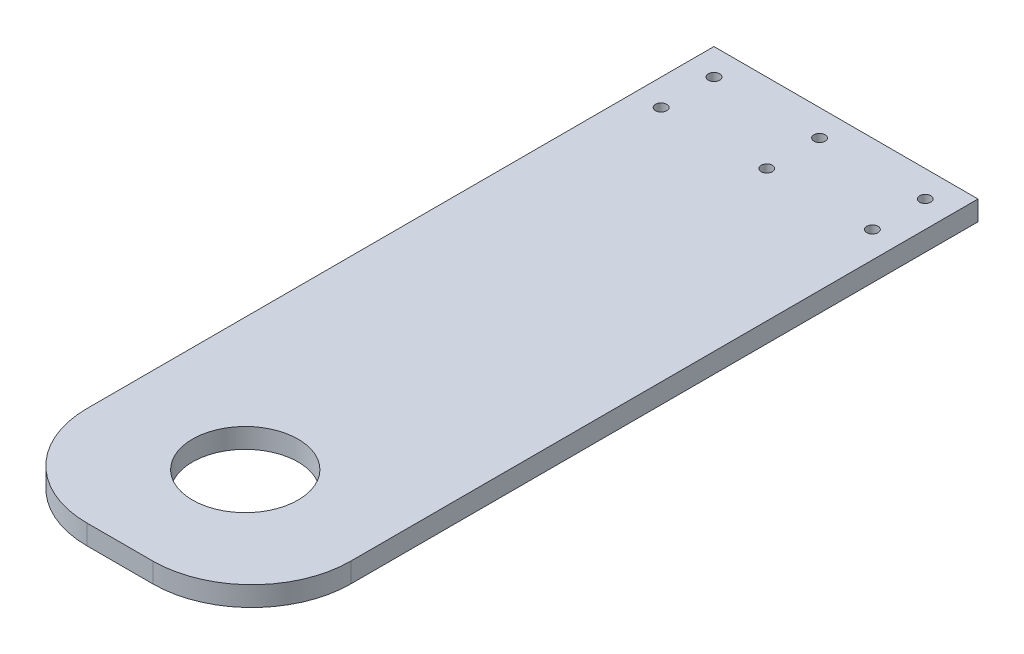
ISO-10303-21;
HEADER;
FILE_DESCRIPTION(('STEP AP214'),'2;1');
FILE_NAME('part.step','',(''),(''),'','','');
FILE_SCHEMA(('AUTOMOTIVE_DESIGN { 1 0 10303 214 1 1 1 1 }'));
ENDSEC;
DATA;
#1=APPLICATION_CONTEXT('core data for automotive mechanical design processes');
#2=APPLICATION_PROTOCOL_DEFINITION('international standard','automotive_design',2000,#1);
#3=PRODUCT_CONTEXT('',#1,'mechanical');
#4=PRODUCT('Part','Part','',(#3));
#5=PRODUCT_RELATED_PRODUCT_CATEGORY('part','',(#4));
#6=PRODUCT_DEFINITION_FORMATION('','',#4);
#7=PRODUCT_DEFINITION_CONTEXT('part definition',#1,'design');
#8=PRODUCT_DEFINITION('design','',#6,#7);
#9=PRODUCT_DEFINITION_SHAPE('','',#8);
#10=(LENGTH_UNIT() NAMED_UNIT(*) SI_UNIT(.MILLI.,.METRE.));
#11=(NAMED_UNIT(*) PLANE_ANGLE_UNIT() SI_UNIT($,.RADIAN.));
#12=(NAMED_UNIT(*) SI_UNIT($,.STERADIAN.) SOLID_ANGLE_UNIT());
#13=UNCERTAINTY_MEASURE_WITH_UNIT(LENGTH_MEASURE(1.E-05),#10,'distance_accuracy_value','');
#14=(GEOMETRIC_REPRESENTATION_CONTEXT(3) GLOBAL_UNCERTAINTY_ASSIGNED_CONTEXT((#13)) GLOBAL_UNIT_ASSIGNED_CONTEXT((#10,
#11,#12)) REPRESENTATION_CONTEXT('',''));
#15=CARTESIAN_POINT('',(0.,0.,0.));
#16=DIRECTION('',(0.,0.,1.));
#17=DIRECTION('',(1.,0.,0.));
#18=AXIS2_PLACEMENT_3D('',#15,#16,#17);
#19=CARTESIAN_POINT('',(0.,6.,0.));
#20=DIRECTION('',(1.,0.,0.));
#21=DIRECTION('',(0.,0.,-1.));
#22=AXIS2_PLACEMENT_3D('',#19,#20,#21);
#23=PLANE('',#22);
#24=DIRECTION('',(0.,0.,1.));
#25=VECTOR('',#24,1.);
#26=CARTESIAN_POINT('',(0.,6.,0.));
#27=LINE('',#26,#25);
#28=CARTESIAN_POINT('',(0.,6.,10.));
#29=VERTEX_POINT('',#28);
#30=CARTESIAN_POINT('',(0.,6.,200.));
#31=VERTEX_POINT('',#30);
#32=EDGE_CURVE('E115',#29,#31,#27,.T.);
#33=ORIENTED_EDGE('',*,*,#32,.F.);
#34=DIRECTION('',(0.,1.,0.));
#35=VECTOR('',#34,1.);
#36=CARTESIAN_POINT('',(0.,0.,10.));
#37=LINE('',#36,#35);
#38=CARTESIAN_POINT('',(0.,0.,10.));
#39=VERTEX_POINT('',#38);
#40=EDGE_CURVE('E101',#39,#29,#37,.T.);
#41=ORIENTED_EDGE('',*,*,#40,.F.);
#42=DIRECTION('',(0.,0.,1.));
#43=VECTOR('',#42,1.);
#44=CARTESIAN_POINT('',(0.,0.,0.));
#45=LINE('',#44,#43);
#46=CARTESIAN_POINT('',(0.,0.,200.));
#47=VERTEX_POINT('',#46);
#48=EDGE_CURVE('E113',#39,#47,#45,.T.);
#49=ORIENTED_EDGE('',*,*,#48,.T.);
#50=DIRECTION('',(0.,-1.,0.));
#51=VECTOR('',#50,1.);
#52=CARTESIAN_POINT('',(0.,6.,200.));
#53=LINE('',#52,#51);
#54=EDGE_CURVE('E152',#47,#31,#53,.F.);
#55=ORIENTED_EDGE('',*,*,#54,.T.);
#56=EDGE_LOOP('',(#33,#41,#49,#55));
#57=FACE_BOUND('',#56,.T.);
#58=ADVANCED_FACE('F45',(#57),#23,.F.);
#59=CARTESIAN_POINT('',(0.,6.,230.));
#60=DIRECTION('',(0.,0.,-1.));
#61=DIRECTION('',(-1.,0.,0.));
#62=AXIS2_PLACEMENT_3D('',#59,#60,#61);
#63=PLANE('',#62);
#64=DIRECTION('',(1.,0.,0.));
#65=VECTOR('',#64,1.);
#66=CARTESIAN_POINT('',(0.,6.,230.));
#67=LINE('',#66,#65);
#68=CARTESIAN_POINT('',(30.,6.,230.));
#69=VERTEX_POINT('',#68);
#70=CARTESIAN_POINT('',(50.,6.,230.));
#71=VERTEX_POINT('',#70);
#72=EDGE_CURVE('E161',#69,#71,#67,.T.);
#73=ORIENTED_EDGE('',*,*,#72,.F.);
#74=DIRECTION('',(0.,-1.,0.));
#75=VECTOR('',#74,1.);
#76=CARTESIAN_POINT('',(30.,6.,230.));
#77=LINE('',#76,#75);
#78=CARTESIAN_POINT('',(30.,0.,230.));
#79=VERTEX_POINT('',#78);
#80=EDGE_CURVE('E143',#69,#79,#77,.T.);
#81=ORIENTED_EDGE('',*,*,#80,.T.);
#82=DIRECTION('',(1.,0.,0.));
#83=VECTOR('',#82,1.);
#84=CARTESIAN_POINT('',(0.,0.,230.));
#85=LINE('',#84,#83);
#86=CARTESIAN_POINT('',(50.,0.,230.));
#87=VERTEX_POINT('',#86);
#88=EDGE_CURVE('E123',#79,#87,#85,.T.);
#89=ORIENTED_EDGE('',*,*,#88,.T.);
#90=DIRECTION('',(0.,-1.,0.));
#91=VECTOR('',#90,1.);
#92=CARTESIAN_POINT('',(50.,6.,230.));
#93=LINE('',#92,#91);
#94=EDGE_CURVE('E140',#87,#71,#93,.F.);
#95=ORIENTED_EDGE('',*,*,#94,.T.);
#96=EDGE_LOOP('',(#73,#81,#89,#95));
#97=FACE_BOUND('',#96,.T.);
#98=ADVANCED_FACE('F165',(#97),#63,.F.);
#99=CARTESIAN_POINT('',(80.,6.,0.));
#100=DIRECTION('',(-1.,0.,0.));
#101=DIRECTION('',(0.,0.,1.));
#102=AXIS2_PLACEMENT_3D('',#99,#100,#101);
#103=PLANE('',#102);
#104=DIRECTION('',(0.,0.,-1.));
#105=VECTOR('',#104,1.);
#106=CARTESIAN_POINT('',(80.,0.,0.));
#107=LINE('',#106,#105);
#108=CARTESIAN_POINT('',(80.,0.,200.));
#109=VERTEX_POINT('',#108);
#110=CARTESIAN_POINT('',(80.,0.,10.));
#111=VERTEX_POINT('',#110);
#112=EDGE_CURVE('E129',#109,#111,#107,.T.);
#113=ORIENTED_EDGE('',*,*,#112,.T.);
#114=DIRECTION('',(0.,1.,0.));
#115=VECTOR('',#114,1.);
#116=CARTESIAN_POINT('',(80.,0.,10.));
#117=LINE('',#116,#115);
#118=CARTESIAN_POINT('',(80.,6.,10.));
#119=VERTEX_POINT('',#118);
#120=EDGE_CURVE('E61',#111,#119,#117,.T.);
#121=ORIENTED_EDGE('',*,*,#120,.T.);
#122=DIRECTION('',(0.,0.,-1.));
#123=VECTOR('',#122,1.);
#124=CARTESIAN_POINT('',(80.,6.,0.));
#125=LINE('',#124,#123);
#126=CARTESIAN_POINT('',(80.,6.,200.));
#127=VERTEX_POINT('',#126);
#128=EDGE_CURVE('E135',#127,#119,#125,.T.);
#129=ORIENTED_EDGE('',*,*,#128,.F.);
#130=DIRECTION('',(0.,-1.,0.));
#131=VECTOR('',#130,1.);
#132=CARTESIAN_POINT('',(80.,6.,200.));
#133=LINE('',#132,#131);
#134=EDGE_CURVE('E11',#127,#109,#133,.T.);
#135=ORIENTED_EDGE('',*,*,#134,.T.);
#136=EDGE_LOOP('',(#113,#121,#129,#135));
#137=FACE_BOUND('',#136,.T.);
#138=ADVANCED_FACE('F186',(#137),#103,.F.);
#139=CARTESIAN_POINT('',(0.,6.,0.));
#140=DIRECTION('',(0.,1.,0.));
#141=DIRECTION('',(0.,0.,1.));
#142=AXIS2_PLACEMENT_3D('',#139,#140,#141);
#143=PLANE('',#142);
#144=DIRECTION('',(1.,0.,0.));
#145=VECTOR('',#144,1.);
#146=CARTESIAN_POINT('',(0.,6.,10.));
#147=LINE('',#146,#145);
#148=EDGE_CURVE('E108',#29,#119,#147,.T.);
#149=ORIENTED_EDGE('',*,*,#148,.F.);
#150=ORIENTED_EDGE('',*,*,#32,.T.);
#151=CARTESIAN_POINT('',(30.,6.,200.));
#152=DIRECTION('',(0.,1.,0.));
#153=DIRECTION('',(0.,0.,1.));
#154=AXIS2_PLACEMENT_3D('',#151,#152,#153);
#155=CIRCLE('',#154,30.);
#156=EDGE_CURVE('E54',#31,#69,#155,.T.);
#157=ORIENTED_EDGE('',*,*,#156,.T.);
#158=ORIENTED_EDGE('',*,*,#72,.T.);
#159=CARTESIAN_POINT('',(50.,6.,200.));
#160=DIRECTION('',(0.,1.,0.));
#161=DIRECTION('',(0.,0.,1.));
#162=AXIS2_PLACEMENT_3D('',#159,#160,#161);
#163=CIRCLE('',#162,30.);
#164=EDGE_CURVE('E69',#71,#127,#163,.T.);
#165=ORIENTED_EDGE('',*,*,#164,.T.);
#166=ORIENTED_EDGE('',*,*,#128,.T.);
#167=EDGE_LOOP('',(#149,#150,#157,#158,#165,#166));
#168=FACE_BOUND('',#167,.T.);
#169=CARTESIAN_POINT('',(8.,6.,18.));
#170=DIRECTION('',(0.,-1.,0.));
#171=DIRECTION('',(0.,0.,-1.));
#172=AXIS2_PLACEMENT_3D('',#169,#170,#171);
#173=CIRCLE('',#172,1.7);
#174=CARTESIAN_POINT('',(8.,6.,16.3));
#175=VERTEX_POINT('',#174);
#176=EDGE_CURVE('E443',#175,#175,#173,.T.);
#177=ORIENTED_EDGE('',*,*,#176,.T.);
#178=EDGE_LOOP('',(#177));
#179=FACE_BOUND('',#178,.T.);
#180=CARTESIAN_POINT('',(40.,6.,18.));
#181=DIRECTION('',(0.,-1.,0.));
#182=DIRECTION('',(0.,0.,-1.));
#183=AXIS2_PLACEMENT_3D('',#180,#181,#182);
#184=CIRCLE('',#183,1.7);
#185=CARTESIAN_POINT('',(40.,6.,16.3));
#186=VERTEX_POINT('',#185);
#187=EDGE_CURVE('E459',#186,#186,#184,.T.);
#188=ORIENTED_EDGE('',*,*,#187,.T.);
#189=EDGE_LOOP('',(#188));
#190=FACE_BOUND('',#189,.T.);
#191=CARTESIAN_POINT('',(72.,6.,18.));
#192=DIRECTION('',(0.,-1.,0.));
#193=DIRECTION('',(0.,0.,-1.));
#194=AXIS2_PLACEMENT_3D('',#191,#192,#193);
#195=CIRCLE('',#194,1.69999999999999);
#196=CARTESIAN_POINT('',(72.,6.,16.3));
#197=VERTEX_POINT('',#196);
#198=EDGE_CURVE('E475',#197,#197,#195,.T.);
#199=ORIENTED_EDGE('',*,*,#198,.T.);
#200=EDGE_LOOP('',(#199));
#201=FACE_BOUND('',#200,.T.);
#202=CARTESIAN_POINT('',(40.0000000000002,6.,34.));
#203=DIRECTION('',(0.,-1.,0.));
#204=DIRECTION('',(0.,0.,-1.));
#205=AXIS2_PLACEMENT_3D('',#202,#203,#204);
#206=CIRCLE('',#205,1.7);
#207=CARTESIAN_POINT('',(40.0000000000002,6.,32.3));
#208=VERTEX_POINT('',#207);
#209=EDGE_CURVE('E491',#208,#208,#206,.T.);
#210=ORIENTED_EDGE('',*,*,#209,.T.);
#211=EDGE_LOOP('',(#210));
#212=FACE_BOUND('',#211,.T.);
#213=CARTESIAN_POINT('',(72.0000000000002,6.,34.));
#214=DIRECTION('',(0.,-1.,0.));
#215=DIRECTION('',(0.,0.,-1.));
#216=AXIS2_PLACEMENT_3D('',#213,#214,#215);
#217=CIRCLE('',#216,1.69999999999999);
#218=CARTESIAN_POINT('',(72.0000000000002,6.,32.3));
#219=VERTEX_POINT('',#218);
#220=EDGE_CURVE('E507',#219,#219,#217,.T.);
#221=ORIENTED_EDGE('',*,*,#220,.T.);
#222=EDGE_LOOP('',(#221));
#223=FACE_BOUND('',#222,.T.);
#224=CARTESIAN_POINT('',(8.00000000000017,6.,34.));
#225=DIRECTION('',(0.,-1.,0.));
#226=DIRECTION('',(0.,0.,-1.));
#227=AXIS2_PLACEMENT_3D('',#224,#225,#226);
#228=CIRCLE('',#227,1.7);
#229=CARTESIAN_POINT('',(8.00000000000017,6.,32.3));
#230=VERTEX_POINT('',#229);
#231=EDGE_CURVE('E523',#230,#230,#228,.T.);
#232=ORIENTED_EDGE('',*,*,#231,.T.);
#233=EDGE_LOOP('',(#232));
#234=FACE_BOUND('',#233,.T.);
#235=CARTESIAN_POINT('',(39.9999999999998,6.,192.));
#236=DIRECTION('',(0.,1.,0.));
#237=DIRECTION('',(0.,0.,1.));
#238=AXIS2_PLACEMENT_3D('',#235,#236,#237);
#239=CIRCLE('',#238,16.);
#240=CARTESIAN_POINT('',(39.9999999999998,6.,208.));
#241=VERTEX_POINT('',#240);
#242=EDGE_CURVE('E132',#241,#241,#239,.T.);
#243=ORIENTED_EDGE('',*,*,#242,.F.);
#244=EDGE_LOOP('',(#243));
#245=FACE_BOUND('',#244,.T.);
#246=ADVANCED_FACE('F159',(#168,#179,#190,#201,#212,#223,#234,#245),#143,.T.);
#247=CARTESIAN_POINT('',(0.,0.,0.));
#248=DIRECTION('',(0.,1.,0.));
#249=DIRECTION('',(0.,0.,1.));
#250=AXIS2_PLACEMENT_3D('',#247,#248,#249);
#251=PLANE('',#250);
#252=CARTESIAN_POINT('',(8.,0.,18.));
#253=DIRECTION('',(0.,-1.,0.));
#254=DIRECTION('',(0.,0.,-1.));
#255=AXIS2_PLACEMENT_3D('',#252,#253,#254);
#256=CIRCLE('',#255,3.25);
#257=CARTESIAN_POINT('',(8.,0.,14.75));
#258=VERTEX_POINT('',#257);
#259=EDGE_CURVE('E431',#258,#258,#256,.T.);
#260=ORIENTED_EDGE('',*,*,#259,.F.);
#261=EDGE_LOOP('',(#260));
#262=FACE_BOUND('',#261,.T.);
#263=CARTESIAN_POINT('',(40.,0.,18.));
#264=DIRECTION('',(0.,-1.,0.));
#265=DIRECTION('',(0.,0.,-1.));
#266=AXIS2_PLACEMENT_3D('',#263,#264,#265);
#267=CIRCLE('',#266,3.25);
#268=CARTESIAN_POINT('',(40.,0.,14.75));
#269=VERTEX_POINT('',#268);
#270=EDGE_CURVE('E447',#269,#269,#267,.T.);
#271=ORIENTED_EDGE('',*,*,#270,.F.);
#272=EDGE_LOOP('',(#271));
#273=FACE_BOUND('',#272,.T.);
#274=CARTESIAN_POINT('',(72.,0.,18.));
#275=DIRECTION('',(0.,-1.,0.));
#276=DIRECTION('',(0.,0.,-1.));
#277=AXIS2_PLACEMENT_3D('',#274,#275,#276);
#278=CIRCLE('',#277,3.25);
#279=CARTESIAN_POINT('',(72.,0.,14.75));
#280=VERTEX_POINT('',#279);
#281=EDGE_CURVE('E463',#280,#280,#278,.T.);
#282=ORIENTED_EDGE('',*,*,#281,.F.);
#283=EDGE_LOOP('',(#282));
#284=FACE_BOUND('',#283,.T.);
#285=CARTESIAN_POINT('',(40.0000000000002,0.,34.));
#286=DIRECTION('',(0.,-1.,0.));
#287=DIRECTION('',(0.,0.,-1.));
#288=AXIS2_PLACEMENT_3D('',#285,#286,#287);
#289=CIRCLE('',#288,3.25);
#290=CARTESIAN_POINT('',(40.0000000000002,0.,30.75));
#291=VERTEX_POINT('',#290);
#292=EDGE_CURVE('E479',#291,#291,#289,.T.);
#293=ORIENTED_EDGE('',*,*,#292,.F.);
#294=EDGE_LOOP('',(#293));
#295=FACE_BOUND('',#294,.T.);
#296=CARTESIAN_POINT('',(72.0000000000002,0.,34.));
#297=DIRECTION('',(0.,-1.,0.));
#298=DIRECTION('',(0.,0.,-1.));
#299=AXIS2_PLACEMENT_3D('',#296,#297,#298);
#300=CIRCLE('',#299,3.25);
#301=CARTESIAN_POINT('',(72.0000000000002,0.,30.75));
#302=VERTEX_POINT('',#301);
#303=EDGE_CURVE('E495',#302,#302,#300,.T.);
#304=ORIENTED_EDGE('',*,*,#303,.F.);
#305=EDGE_LOOP('',(#304));
#306=FACE_BOUND('',#305,.T.);
#307=CARTESIAN_POINT('',(8.00000000000017,0.,34.));
#308=DIRECTION('',(0.,-1.,0.));
#309=DIRECTION('',(0.,0.,-1.));
#310=AXIS2_PLACEMENT_3D('',#307,#308,#309);
#311=CIRCLE('',#310,3.25);
#312=CARTESIAN_POINT('',(8.00000000000017,0.,30.75));
#313=VERTEX_POINT('',#312);
#314=EDGE_CURVE('E511',#313,#313,#311,.T.);
#315=ORIENTED_EDGE('',*,*,#314,.F.);
#316=EDGE_LOOP('',(#315));
#317=FACE_BOUND('',#316,.T.);
#318=CARTESIAN_POINT('',(39.9999999999998,0.,192.));
#319=DIRECTION('',(0.,1.,0.));
#320=DIRECTION('',(0.,0.,1.));
#321=AXIS2_PLACEMENT_3D('',#318,#319,#320);
#322=CIRCLE('',#321,16.);
#323=CARTESIAN_POINT('',(39.9999999999998,0.,208.));
#324=VERTEX_POINT('',#323);
#325=EDGE_CURVE('E124',#324,#324,#322,.T.);
#326=ORIENTED_EDGE('',*,*,#325,.T.);
#327=EDGE_LOOP('',(#326));
#328=FACE_BOUND('',#327,.T.);
#329=ORIENTED_EDGE('',*,*,#48,.F.);
#330=DIRECTION('',(1.,0.,0.));
#331=VECTOR('',#330,1.);
#332=CARTESIAN_POINT('',(0.,0.,10.));
#333=LINE('',#332,#331);
#334=EDGE_CURVE('E98',#39,#111,#333,.T.);
#335=ORIENTED_EDGE('',*,*,#334,.T.);
#336=ORIENTED_EDGE('',*,*,#112,.F.);
#337=CARTESIAN_POINT('',(50.,0.,200.));
#338=DIRECTION('',(0.,1.,0.));
#339=DIRECTION('',(0.,0.,1.));
#340=AXIS2_PLACEMENT_3D('',#337,#338,#339);
#341=CIRCLE('',#340,30.);
#342=EDGE_CURVE('E147',#109,#87,#341,.F.);
#343=ORIENTED_EDGE('',*,*,#342,.T.);
#344=ORIENTED_EDGE('',*,*,#88,.F.);
#345=CARTESIAN_POINT('',(30.,0.,200.));
#346=DIRECTION('',(0.,1.,0.));
#347=DIRECTION('',(0.,0.,1.));
#348=AXIS2_PLACEMENT_3D('',#345,#346,#347);
#349=CIRCLE('',#348,30.);
#350=EDGE_CURVE('E120',#79,#47,#349,.F.);
#351=ORIENTED_EDGE('',*,*,#350,.T.);
#352=EDGE_LOOP('',(#329,#335,#336,#343,#344,#351));
#353=FACE_BOUND('',#352,.T.);
#354=ADVANCED_FACE('F118',(#262,#273,#284,#295,#306,#317,#328,#353),#251,.F.);
#355=CARTESIAN_POINT('',(39.9999999999998,6.,192.));
#356=DIRECTION('',(0.,1.,0.));
#357=DIRECTION('',(0.,0.,1.));
#358=AXIS2_PLACEMENT_3D('',#355,#356,#357);
#359=CYLINDRICAL_SURFACE('',#358,16.);
#360=ORIENTED_EDGE('',*,*,#325,.F.);
#361=EDGE_LOOP('',(#360));
#362=FACE_BOUND('',#361,.T.);
#363=ORIENTED_EDGE('',*,*,#242,.T.);
#364=EDGE_LOOP('',(#363));
#365=FACE_BOUND('',#364,.T.);
#366=ADVANCED_FACE('F170',(#362,#365),#359,.F.);
#367=CARTESIAN_POINT('',(30.,6.,200.));
#368=DIRECTION('',(0.,-1.,0.));
#369=DIRECTION('',(0.,0.,-1.));
#370=AXIS2_PLACEMENT_3D('',#367,#368,#369);
#371=CYLINDRICAL_SURFACE('',#370,30.);
#372=ORIENTED_EDGE('',*,*,#156,.F.);
#373=ORIENTED_EDGE('',*,*,#54,.F.);
#374=ORIENTED_EDGE('',*,*,#350,.F.);
#375=ORIENTED_EDGE('',*,*,#80,.F.);
#376=EDGE_LOOP('',(#372,#373,#374,#375));
#377=FACE_BOUND('',#376,.T.);
#378=ADVANCED_FACE('F168',(#377),#371,.T.);
#379=CARTESIAN_POINT('',(50.,6.,200.));
#380=DIRECTION('',(0.,-1.,0.));
#381=DIRECTION('',(0.,0.,-1.));
#382=AXIS2_PLACEMENT_3D('',#379,#380,#381);
#383=CYLINDRICAL_SURFACE('',#382,30.);
#384=ORIENTED_EDGE('',*,*,#164,.F.);
#385=ORIENTED_EDGE('',*,*,#94,.F.);
#386=ORIENTED_EDGE('',*,*,#342,.F.);
#387=ORIENTED_EDGE('',*,*,#134,.F.);
#388=EDGE_LOOP('',(#384,#385,#386,#387));
#389=FACE_BOUND('',#388,.T.);
#390=ADVANCED_FACE('F47',(#389),#383,.T.);
#391=CARTESIAN_POINT('',(8.00000000000017,0.,34.));
#392=DIRECTION('',(0.,-1.,0.));
#393=DIRECTION('',(0.,0.,-1.));
#394=AXIS2_PLACEMENT_3D('',#391,#392,#393);
#395=CYLINDRICAL_SURFACE('',#394,1.7);
#396=ORIENTED_EDGE('',*,*,#231,.F.);
#397=EDGE_LOOP('',(#396));
#398=FACE_BOUND('',#397,.T.);
#399=CARTESIAN_POINT('',(8.00000000000017,3.4,34.));
#400=DIRECTION('',(0.,-1.,0.));
#401=DIRECTION('',(0.,0.,-1.));
#402=AXIS2_PLACEMENT_3D('',#399,#400,#401);
#403=CIRCLE('',#402,1.7);
#404=CARTESIAN_POINT('',(8.00000000000017,3.4,32.3));
#405=VERTEX_POINT('',#404);
#406=EDGE_CURVE('E519',#405,#405,#403,.T.);
#407=ORIENTED_EDGE('',*,*,#406,.T.);
#408=EDGE_LOOP('',(#407));
#409=FACE_BOUND('',#408,.T.);
#410=ADVANCED_FACE('F175',(#398,#409),#395,.F.);
#411=CARTESIAN_POINT('',(9.70000000000017,3.4,34.));
#412=DIRECTION('',(0.,1.,0.));
#413=DIRECTION('',(0.,0.,1.));
#414=AXIS2_PLACEMENT_3D('',#411,#412,#413);
#415=PLANE('',#414);
#416=ORIENTED_EDGE('',*,*,#406,.F.);
#417=EDGE_LOOP('',(#416));
#418=FACE_BOUND('',#417,.T.);
#419=CARTESIAN_POINT('',(8.00000000000017,3.4,34.));
#420=DIRECTION('',(0.,-1.,0.));
#421=DIRECTION('',(0.,0.,-1.));
#422=AXIS2_PLACEMENT_3D('',#419,#420,#421);
#423=CIRCLE('',#422,3.25);
#424=CARTESIAN_POINT('',(8.00000000000017,3.4,30.75));
#425=VERTEX_POINT('',#424);
#426=EDGE_CURVE('E515',#425,#425,#423,.T.);
#427=ORIENTED_EDGE('',*,*,#426,.T.);
#428=EDGE_LOOP('',(#427));
#429=FACE_BOUND('',#428,.T.);
#430=ADVANCED_FACE('F198',(#418,#429),#415,.F.);
#431=CARTESIAN_POINT('',(8.00000000000017,0.,34.));
#432=DIRECTION('',(0.,-1.,0.));
#433=DIRECTION('',(0.,0.,-1.));
#434=AXIS2_PLACEMENT_3D('',#431,#432,#433);
#435=CYLINDRICAL_SURFACE('',#434,3.25);
#436=ORIENTED_EDGE('',*,*,#426,.F.);
#437=EDGE_LOOP('',(#436));
#438=FACE_BOUND('',#437,.T.);
#439=ORIENTED_EDGE('',*,*,#314,.T.);
#440=EDGE_LOOP('',(#439));
#441=FACE_BOUND('',#440,.T.);
#442=ADVANCED_FACE('F202',(#438,#441),#435,.F.);
#443=CARTESIAN_POINT('',(72.0000000000002,0.,34.));
#444=DIRECTION('',(0.,-1.,0.));
#445=DIRECTION('',(0.,0.,-1.));
#446=AXIS2_PLACEMENT_3D('',#443,#444,#445);
#447=CYLINDRICAL_SURFACE('',#446,1.69999999999999);
#448=ORIENTED_EDGE('',*,*,#220,.F.);
#449=EDGE_LOOP('',(#448));
#450=FACE_BOUND('',#449,.T.);
#451=CARTESIAN_POINT('',(72.0000000000002,3.4,34.));
#452=DIRECTION('',(0.,-1.,0.));
#453=DIRECTION('',(0.,0.,-1.));
#454=AXIS2_PLACEMENT_3D('',#451,#452,#453);
#455=CIRCLE('',#454,1.69999999999999);
#456=CARTESIAN_POINT('',(72.0000000000002,3.4,32.3));
#457=VERTEX_POINT('',#456);
#458=EDGE_CURVE('E503',#457,#457,#455,.T.);
#459=ORIENTED_EDGE('',*,*,#458,.T.);
#460=EDGE_LOOP('',(#459));
#461=FACE_BOUND('',#460,.T.);
#462=ADVANCED_FACE('F206',(#450,#461),#447,.F.);
#463=CARTESIAN_POINT('',(73.7000000000002,3.4,34.));
#464=DIRECTION('',(0.,1.,0.));
#465=DIRECTION('',(0.,0.,1.));
#466=AXIS2_PLACEMENT_3D('',#463,#464,#465);
#467=PLANE('',#466);
#468=ORIENTED_EDGE('',*,*,#458,.F.);
#469=EDGE_LOOP('',(#468));
#470=FACE_BOUND('',#469,.T.);
#471=CARTESIAN_POINT('',(72.0000000000002,3.4,34.));
#472=DIRECTION('',(0.,-1.,0.));
#473=DIRECTION('',(0.,0.,-1.));
#474=AXIS2_PLACEMENT_3D('',#471,#472,#473);
#475=CIRCLE('',#474,3.25);
#476=CARTESIAN_POINT('',(72.0000000000002,3.4,30.75));
#477=VERTEX_POINT('',#476);
#478=EDGE_CURVE('E499',#477,#477,#475,.T.);
#479=ORIENTED_EDGE('',*,*,#478,.T.);
#480=EDGE_LOOP('',(#479));
#481=FACE_BOUND('',#480,.T.);
#482=ADVANCED_FACE('F210',(#470,#481),#467,.F.);
#483=CARTESIAN_POINT('',(72.0000000000002,0.,34.));
#484=DIRECTION('',(0.,-1.,0.));
#485=DIRECTION('',(0.,0.,-1.));
#486=AXIS2_PLACEMENT_3D('',#483,#484,#485);
#487=CYLINDRICAL_SURFACE('',#486,3.25);
#488=ORIENTED_EDGE('',*,*,#478,.F.);
#489=EDGE_LOOP('',(#488));
#490=FACE_BOUND('',#489,.T.);
#491=ORIENTED_EDGE('',*,*,#303,.T.);
#492=EDGE_LOOP('',(#491));
#493=FACE_BOUND('',#492,.T.);
#494=ADVANCED_FACE('F214',(#490,#493),#487,.F.);
#495=CARTESIAN_POINT('',(40.0000000000002,0.,34.));
#496=DIRECTION('',(0.,-1.,0.));
#497=DIRECTION('',(0.,0.,-1.));
#498=AXIS2_PLACEMENT_3D('',#495,#496,#497);
#499=CYLINDRICAL_SURFACE('',#498,1.7);
#500=ORIENTED_EDGE('',*,*,#209,.F.);
#501=EDGE_LOOP('',(#500));
#502=FACE_BOUND('',#501,.T.);
#503=CARTESIAN_POINT('',(40.0000000000002,3.4,34.));
#504=DIRECTION('',(0.,-1.,0.));
#505=DIRECTION('',(0.,0.,-1.));
#506=AXIS2_PLACEMENT_3D('',#503,#504,#505);
#507=CIRCLE('',#506,1.7);
#508=CARTESIAN_POINT('',(40.0000000000002,3.4,32.3));
#509=VERTEX_POINT('',#508);
#510=EDGE_CURVE('E487',#509,#509,#507,.T.);
#511=ORIENTED_EDGE('',*,*,#510,.T.);
#512=EDGE_LOOP('',(#511));
#513=FACE_BOUND('',#512,.T.);
#514=ADVANCED_FACE('F218',(#502,#513),#499,.F.);
#515=CARTESIAN_POINT('',(41.7000000000002,3.4,34.));
#516=DIRECTION('',(0.,1.,0.));
#517=DIRECTION('',(0.,0.,1.));
#518=AXIS2_PLACEMENT_3D('',#515,#516,#517);
#519=PLANE('',#518);
#520=ORIENTED_EDGE('',*,*,#510,.F.);
#521=EDGE_LOOP('',(#520));
#522=FACE_BOUND('',#521,.T.);
#523=CARTESIAN_POINT('',(40.0000000000002,3.4,34.));
#524=DIRECTION('',(0.,-1.,0.));
#525=DIRECTION('',(0.,0.,-1.));
#526=AXIS2_PLACEMENT_3D('',#523,#524,#525);
#527=CIRCLE('',#526,3.25);
#528=CARTESIAN_POINT('',(40.0000000000002,3.4,30.75));
#529=VERTEX_POINT('',#528);
#530=EDGE_CURVE('E483',#529,#529,#527,.T.);
#531=ORIENTED_EDGE('',*,*,#530,.T.);
#532=EDGE_LOOP('',(#531));
#533=FACE_BOUND('',#532,.T.);
#534=ADVANCED_FACE('F222',(#522,#533),#519,.F.);
#535=CARTESIAN_POINT('',(40.0000000000002,0.,34.));
#536=DIRECTION('',(0.,-1.,0.));
#537=DIRECTION('',(0.,0.,-1.));
#538=AXIS2_PLACEMENT_3D('',#535,#536,#537);
#539=CYLINDRICAL_SURFACE('',#538,3.25);
#540=ORIENTED_EDGE('',*,*,#530,.F.);
#541=EDGE_LOOP('',(#540));
#542=FACE_BOUND('',#541,.T.);
#543=ORIENTED_EDGE('',*,*,#292,.T.);
#544=EDGE_LOOP('',(#543));
#545=FACE_BOUND('',#544,.T.);
#546=ADVANCED_FACE('F226',(#542,#545),#539,.F.);
#547=CARTESIAN_POINT('',(72.,0.,18.));
#548=DIRECTION('',(0.,-1.,0.));
#549=DIRECTION('',(0.,0.,-1.));
#550=AXIS2_PLACEMENT_3D('',#547,#548,#549);
#551=CYLINDRICAL_SURFACE('',#550,1.69999999999999);
#552=ORIENTED_EDGE('',*,*,#198,.F.);
#553=EDGE_LOOP('',(#552));
#554=FACE_BOUND('',#553,.T.);
#555=CARTESIAN_POINT('',(72.,3.4,18.));
#556=DIRECTION('',(0.,-1.,0.));
#557=DIRECTION('',(0.,0.,-1.));
#558=AXIS2_PLACEMENT_3D('',#555,#556,#557);
#559=CIRCLE('',#558,1.69999999999999);
#560=CARTESIAN_POINT('',(72.,3.4,16.3));
#561=VERTEX_POINT('',#560);
#562=EDGE_CURVE('E471',#561,#561,#559,.T.);
#563=ORIENTED_EDGE('',*,*,#562,.T.);
#564=EDGE_LOOP('',(#563));
#565=FACE_BOUND('',#564,.T.);
#566=ADVANCED_FACE('F230',(#554,#565),#551,.F.);
#567=CARTESIAN_POINT('',(73.7,3.4,18.));
#568=DIRECTION('',(0.,1.,0.));
#569=DIRECTION('',(0.,0.,1.));
#570=AXIS2_PLACEMENT_3D('',#567,#568,#569);
#571=PLANE('',#570);
#572=ORIENTED_EDGE('',*,*,#562,.F.);
#573=EDGE_LOOP('',(#572));
#574=FACE_BOUND('',#573,.T.);
#575=CARTESIAN_POINT('',(72.,3.4,18.));
#576=DIRECTION('',(0.,-1.,0.));
#577=DIRECTION('',(0.,0.,-1.));
#578=AXIS2_PLACEMENT_3D('',#575,#576,#577);
#579=CIRCLE('',#578,3.25);
#580=CARTESIAN_POINT('',(72.,3.4,14.75));
#581=VERTEX_POINT('',#580);
#582=EDGE_CURVE('E467',#581,#581,#579,.T.);
#583=ORIENTED_EDGE('',*,*,#582,.T.);
#584=EDGE_LOOP('',(#583));
#585=FACE_BOUND('',#584,.T.);
#586=ADVANCED_FACE('F234',(#574,#585),#571,.F.);
#587=CARTESIAN_POINT('',(72.,0.,18.));
#588=DIRECTION('',(0.,-1.,0.));
#589=DIRECTION('',(0.,0.,-1.));
#590=AXIS2_PLACEMENT_3D('',#587,#588,#589);
#591=CYLINDRICAL_SURFACE('',#590,3.25);
#592=ORIENTED_EDGE('',*,*,#582,.F.);
#593=EDGE_LOOP('',(#592));
#594=FACE_BOUND('',#593,.T.);
#595=ORIENTED_EDGE('',*,*,#281,.T.);
#596=EDGE_LOOP('',(#595));
#597=FACE_BOUND('',#596,.T.);
#598=ADVANCED_FACE('F238',(#594,#597),#591,.F.);
#599=CARTESIAN_POINT('',(40.,0.,18.));
#600=DIRECTION('',(0.,-1.,0.));
#601=DIRECTION('',(0.,0.,-1.));
#602=AXIS2_PLACEMENT_3D('',#599,#600,#601);
#603=CYLINDRICAL_SURFACE('',#602,1.7);
#604=ORIENTED_EDGE('',*,*,#187,.F.);
#605=EDGE_LOOP('',(#604));
#606=FACE_BOUND('',#605,.T.);
#607=CARTESIAN_POINT('',(40.,3.4,18.));
#608=DIRECTION('',(0.,-1.,0.));
#609=DIRECTION('',(0.,0.,-1.));
#610=AXIS2_PLACEMENT_3D('',#607,#608,#609);
#611=CIRCLE('',#610,1.7);
#612=CARTESIAN_POINT('',(40.,3.4,16.3));
#613=VERTEX_POINT('',#612);
#614=EDGE_CURVE('E455',#613,#613,#611,.T.);
#615=ORIENTED_EDGE('',*,*,#614,.T.);
#616=EDGE_LOOP('',(#615));
#617=FACE_BOUND('',#616,.T.);
#618=ADVANCED_FACE('F242',(#606,#617),#603,.F.);
#619=CARTESIAN_POINT('',(41.7,3.4,18.));
#620=DIRECTION('',(0.,1.,0.));
#621=DIRECTION('',(0.,0.,1.));
#622=AXIS2_PLACEMENT_3D('',#619,#620,#621);
#623=PLANE('',#622);
#624=ORIENTED_EDGE('',*,*,#614,.F.);
#625=EDGE_LOOP('',(#624));
#626=FACE_BOUND('',#625,.T.);
#627=CARTESIAN_POINT('',(40.,3.4,18.));
#628=DIRECTION('',(0.,-1.,0.));
#629=DIRECTION('',(0.,0.,-1.));
#630=AXIS2_PLACEMENT_3D('',#627,#628,#629);
#631=CIRCLE('',#630,3.25);
#632=CARTESIAN_POINT('',(40.,3.4,14.75));
#633=VERTEX_POINT('',#632);
#634=EDGE_CURVE('E451',#633,#633,#631,.T.);
#635=ORIENTED_EDGE('',*,*,#634,.T.);
#636=EDGE_LOOP('',(#635));
#637=FACE_BOUND('',#636,.T.);
#638=ADVANCED_FACE('F246',(#626,#637),#623,.F.);
#639=CARTESIAN_POINT('',(40.,0.,18.));
#640=DIRECTION('',(0.,-1.,0.));
#641=DIRECTION('',(0.,0.,-1.));
#642=AXIS2_PLACEMENT_3D('',#639,#640,#641);
#643=CYLINDRICAL_SURFACE('',#642,3.25);
#644=ORIENTED_EDGE('',*,*,#634,.F.);
#645=EDGE_LOOP('',(#644));
#646=FACE_BOUND('',#645,.T.);
#647=ORIENTED_EDGE('',*,*,#270,.T.);
#648=EDGE_LOOP('',(#647));
#649=FACE_BOUND('',#648,.T.);
#650=ADVANCED_FACE('F250',(#646,#649),#643,.F.);
#651=CARTESIAN_POINT('',(8.,0.,18.));
#652=DIRECTION('',(0.,-1.,0.));
#653=DIRECTION('',(0.,0.,-1.));
#654=AXIS2_PLACEMENT_3D('',#651,#652,#653);
#655=CYLINDRICAL_SURFACE('',#654,1.7);
#656=ORIENTED_EDGE('',*,*,#176,.F.);
#657=EDGE_LOOP('',(#656));
#658=FACE_BOUND('',#657,.T.);
#659=CARTESIAN_POINT('',(8.,3.4,18.));
#660=DIRECTION('',(0.,-1.,0.));
#661=DIRECTION('',(0.,0.,-1.));
#662=AXIS2_PLACEMENT_3D('',#659,#660,#661);
#663=CIRCLE('',#662,1.7);
#664=CARTESIAN_POINT('',(8.,3.4,16.3));
#665=VERTEX_POINT('',#664);
#666=EDGE_CURVE('E436',#665,#665,#663,.T.);
#667=ORIENTED_EDGE('',*,*,#666,.T.);
#668=EDGE_LOOP('',(#667));
#669=FACE_BOUND('',#668,.T.);
#670=ADVANCED_FACE('F254',(#658,#669),#655,.F.);
#671=CARTESIAN_POINT('',(9.7,3.4,18.));
#672=DIRECTION('',(0.,1.,0.));
#673=DIRECTION('',(0.,0.,1.));
#674=AXIS2_PLACEMENT_3D('',#671,#672,#673);
#675=PLANE('',#674);
#676=ORIENTED_EDGE('',*,*,#666,.F.);
#677=EDGE_LOOP('',(#676));
#678=FACE_BOUND('',#677,.T.);
#679=CARTESIAN_POINT('',(8.,3.4,18.));
#680=DIRECTION('',(0.,-1.,0.));
#681=DIRECTION('',(0.,0.,-1.));
#682=AXIS2_PLACEMENT_3D('',#679,#680,#681);
#683=CIRCLE('',#682,3.25);
#684=CARTESIAN_POINT('',(8.,3.4,14.75));
#685=VERTEX_POINT('',#684);
#686=EDGE_CURVE('E428',#685,#685,#683,.T.);
#687=ORIENTED_EDGE('',*,*,#686,.T.);
#688=EDGE_LOOP('',(#687));
#689=FACE_BOUND('',#688,.T.);
#690=ADVANCED_FACE('F258',(#678,#689),#675,.F.);
#691=CARTESIAN_POINT('',(8.,0.,18.));
#692=DIRECTION('',(0.,-1.,0.));
#693=DIRECTION('',(0.,0.,-1.));
#694=AXIS2_PLACEMENT_3D('',#691,#692,#693);
#695=CYLINDRICAL_SURFACE('',#694,3.25);
#696=ORIENTED_EDGE('',*,*,#686,.F.);
#697=EDGE_LOOP('',(#696));
#698=FACE_BOUND('',#697,.T.);
#699=ORIENTED_EDGE('',*,*,#259,.T.);
#700=EDGE_LOOP('',(#699));
#701=FACE_BOUND('',#700,.T.);
#702=ADVANCED_FACE('F262',(#698,#701),#695,.F.);
#703=CARTESIAN_POINT('',(0.,0.,10.));
#704=DIRECTION('',(0.,0.,1.));
#705=DIRECTION('',(1.,0.,0.));
#706=AXIS2_PLACEMENT_3D('',#703,#704,#705);
#707=PLANE('',#706);
#708=ORIENTED_EDGE('',*,*,#148,.T.);
#709=ORIENTED_EDGE('',*,*,#120,.F.);
#710=ORIENTED_EDGE('',*,*,#334,.F.);
#711=ORIENTED_EDGE('',*,*,#40,.T.);
#712=EDGE_LOOP('',(#708,#709,#710,#711));
#713=FACE_BOUND('',#712,.T.);
#714=ADVANCED_FACE('F100',(#713),#707,.F.);
#715=CLOSED_SHELL('',(#58,#98,#138,#246,#354,#366,#378,#390,#410,#430,#442,#462,#482,#494,#514,
#534,#546,#566,#586,#598,#618,#638,#650,#670,#690,#702,#714));
#716=MANIFOLD_SOLID_BREP('B2',#715);
#717=ADVANCED_BREP_SHAPE_REPRESENTATION('',(#18,#716),#14);
#718=SHAPE_DEFINITION_REPRESENTATION(#9,#717);
ENDSEC;
END-ISO-10303-21;
